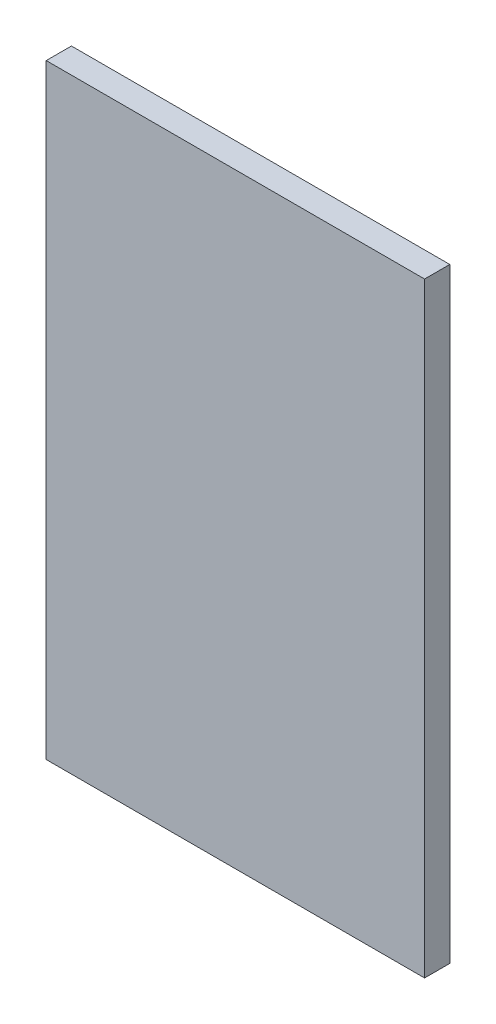
ISO-10303-21;
HEADER;
FILE_DESCRIPTION(('STEP AP214'),'2;1');
FILE_NAME('part.step','',(''),(''),'','','');
FILE_SCHEMA(('AUTOMOTIVE_DESIGN { 1 0 10303 214 1 1 1 1 }'));
ENDSEC;
DATA;
#1=APPLICATION_CONTEXT('core data for automotive mechanical design processes');
#2=APPLICATION_PROTOCOL_DEFINITION('international standard','automotive_design',2000,#1);
#3=PRODUCT_CONTEXT('',#1,'mechanical');
#4=PRODUCT('Part','Part','',(#3));
#5=PRODUCT_RELATED_PRODUCT_CATEGORY('part','',(#4));
#6=PRODUCT_DEFINITION_FORMATION('','',#4);
#7=PRODUCT_DEFINITION_CONTEXT('part definition',#1,'design');
#8=PRODUCT_DEFINITION('design','',#6,#7);
#9=PRODUCT_DEFINITION_SHAPE('','',#8);
#10=(LENGTH_UNIT() NAMED_UNIT(*) SI_UNIT(.MILLI.,.METRE.));
#11=(NAMED_UNIT(*) PLANE_ANGLE_UNIT() SI_UNIT($,.RADIAN.));
#12=(NAMED_UNIT(*) SI_UNIT($,.STERADIAN.) SOLID_ANGLE_UNIT());
#13=UNCERTAINTY_MEASURE_WITH_UNIT(LENGTH_MEASURE(1.E-05),#10,'distance_accuracy_value','');
#14=(GEOMETRIC_REPRESENTATION_CONTEXT(3) GLOBAL_UNCERTAINTY_ASSIGNED_CONTEXT((#13)) GLOBAL_UNIT_ASSIGNED_CONTEXT((#10,
#11,#12)) REPRESENTATION_CONTEXT('',''));
#15=CARTESIAN_POINT('',(0.,0.,0.));
#16=DIRECTION('',(0.,0.,1.));
#17=DIRECTION('',(1.,0.,0.));
#18=AXIS2_PLACEMENT_3D('',#15,#16,#17);
#19=CARTESIAN_POINT('',(-37.5,0.,5.));
#20=DIRECTION('',(1.,0.,0.));
#21=DIRECTION('',(0.,1.,0.));
#22=AXIS2_PLACEMENT_3D('',#19,#20,#21);
#23=PLANE('',#22);
#24=DIRECTION('',(0.,-1.,0.));
#25=VECTOR('',#24,1.);
#26=CARTESIAN_POINT('',(-37.5,0.,0.));
#27=LINE('',#26,#25);
#28=CARTESIAN_POINT('',(-37.5,0.,0.));
#29=VERTEX_POINT('',#28);
#30=CARTESIAN_POINT('',(-37.5,-120.,0.));
#31=VERTEX_POINT('',#30);
#32=EDGE_CURVE('E100',#29,#31,#27,.T.);
#33=ORIENTED_EDGE('',*,*,#32,.T.);
#34=DIRECTION('',(0.,0.,-1.));
#35=VECTOR('',#34,1.);
#36=CARTESIAN_POINT('',(-37.5,-120.,5.));
#37=LINE('',#36,#35);
#38=CARTESIAN_POINT('',(-37.5,-120.,5.));
#39=VERTEX_POINT('',#38);
#40=EDGE_CURVE('E11',#39,#31,#37,.T.);
#41=ORIENTED_EDGE('',*,*,#40,.F.);
#42=DIRECTION('',(0.,-1.,0.));
#43=VECTOR('',#42,1.);
#44=CARTESIAN_POINT('',(-37.5,0.,5.));
#45=LINE('',#44,#43);
#46=CARTESIAN_POINT('',(-37.5,0.,5.));
#47=VERTEX_POINT('',#46);
#48=EDGE_CURVE('E88',#47,#39,#45,.T.);
#49=ORIENTED_EDGE('',*,*,#48,.F.);
#50=DIRECTION('',(0.,0.,-1.));
#51=VECTOR('',#50,1.);
#52=CARTESIAN_POINT('',(-37.5,0.,5.));
#53=LINE('',#52,#51);
#54=EDGE_CURVE('E96',#47,#29,#53,.T.);
#55=ORIENTED_EDGE('',*,*,#54,.T.);
#56=EDGE_LOOP('',(#33,#41,#49,#55));
#57=FACE_BOUND('',#56,.T.);
#58=ADVANCED_FACE('F37',(#57),#23,.F.);
#59=CARTESIAN_POINT('',(-37.5,-120.,5.));
#60=DIRECTION('',(0.,1.,0.));
#61=DIRECTION('',(0.,0.,1.));
#62=AXIS2_PLACEMENT_3D('',#59,#60,#61);
#63=PLANE('',#62);
#64=DIRECTION('',(1.,0.,0.));
#65=VECTOR('',#64,1.);
#66=CARTESIAN_POINT('',(-37.5,-120.,0.));
#67=LINE('',#66,#65);
#68=CARTESIAN_POINT('',(37.5,-120.,0.));
#69=VERTEX_POINT('',#68);
#70=EDGE_CURVE('E92',#31,#69,#67,.T.);
#71=ORIENTED_EDGE('',*,*,#70,.T.);
#72=DIRECTION('',(0.,0.,-1.));
#73=VECTOR('',#72,1.);
#74=CARTESIAN_POINT('',(37.5,-120.,5.));
#75=LINE('',#74,#73);
#76=CARTESIAN_POINT('',(37.5,-120.,5.));
#77=VERTEX_POINT('',#76);
#78=EDGE_CURVE('E45',#77,#69,#75,.T.);
#79=ORIENTED_EDGE('',*,*,#78,.F.);
#80=DIRECTION('',(1.,0.,0.));
#81=VECTOR('',#80,1.);
#82=CARTESIAN_POINT('',(-37.5,-120.,5.));
#83=LINE('',#82,#81);
#84=EDGE_CURVE('E83',#39,#77,#83,.T.);
#85=ORIENTED_EDGE('',*,*,#84,.F.);
#86=ORIENTED_EDGE('',*,*,#40,.T.);
#87=EDGE_LOOP('',(#71,#79,#85,#86));
#88=FACE_BOUND('',#87,.T.);
#89=ADVANCED_FACE('F91',(#88),#63,.F.);
#90=CARTESIAN_POINT('',(37.5,0.,5.));
#91=DIRECTION('',(-1.,0.,0.));
#92=DIRECTION('',(0.,-1.,0.));
#93=AXIS2_PLACEMENT_3D('',#90,#91,#92);
#94=PLANE('',#93);
#95=DIRECTION('',(0.,1.,0.));
#96=VECTOR('',#95,1.);
#97=CARTESIAN_POINT('',(37.5,0.,0.));
#98=LINE('',#97,#96);
#99=CARTESIAN_POINT('',(37.5,0.,0.));
#100=VERTEX_POINT('',#99);
#101=EDGE_CURVE('E70',#69,#100,#98,.T.);
#102=ORIENTED_EDGE('',*,*,#101,.T.);
#103=DIRECTION('',(0.,0.,-1.));
#104=VECTOR('',#103,1.);
#105=CARTESIAN_POINT('',(37.5,0.,5.));
#106=LINE('',#105,#104);
#107=CARTESIAN_POINT('',(37.5,0.,5.));
#108=VERTEX_POINT('',#107);
#109=EDGE_CURVE('E93',#108,#100,#106,.T.);
#110=ORIENTED_EDGE('',*,*,#109,.F.);
#111=DIRECTION('',(0.,1.,0.));
#112=VECTOR('',#111,1.);
#113=CARTESIAN_POINT('',(37.5,0.,5.));
#114=LINE('',#113,#112);
#115=EDGE_CURVE('E86',#77,#108,#114,.T.);
#116=ORIENTED_EDGE('',*,*,#115,.F.);
#117=ORIENTED_EDGE('',*,*,#78,.T.);
#118=EDGE_LOOP('',(#102,#110,#116,#117));
#119=FACE_BOUND('',#118,.T.);
#120=ADVANCED_FACE('F94',(#119),#94,.F.);
#121=CARTESIAN_POINT('',(-37.5,0.,5.));
#122=DIRECTION('',(0.,-1.,0.));
#123=DIRECTION('',(0.,0.,-1.));
#124=AXIS2_PLACEMENT_3D('',#121,#122,#123);
#125=PLANE('',#124);
#126=DIRECTION('',(-1.,0.,0.));
#127=VECTOR('',#126,1.);
#128=CARTESIAN_POINT('',(-37.5,0.,0.));
#129=LINE('',#128,#127);
#130=EDGE_CURVE('E76',#100,#29,#129,.T.);
#131=ORIENTED_EDGE('',*,*,#130,.T.);
#132=ORIENTED_EDGE('',*,*,#54,.F.);
#133=DIRECTION('',(-1.,0.,0.));
#134=VECTOR('',#133,1.);
#135=CARTESIAN_POINT('',(-37.5,0.,5.));
#136=LINE('',#135,#134);
#137=EDGE_CURVE('E53',#108,#47,#136,.T.);
#138=ORIENTED_EDGE('',*,*,#137,.F.);
#139=ORIENTED_EDGE('',*,*,#109,.T.);
#140=EDGE_LOOP('',(#131,#132,#138,#139));
#141=FACE_BOUND('',#140,.T.);
#142=ADVANCED_FACE('F107',(#141),#125,.F.);
#143=CARTESIAN_POINT('',(0.,0.,5.));
#144=DIRECTION('',(0.,0.,1.));
#145=DIRECTION('',(1.,0.,0.));
#146=AXIS2_PLACEMENT_3D('',#143,#144,#145);
#147=PLANE('',#146);
#148=ORIENTED_EDGE('',*,*,#48,.T.);
#149=ORIENTED_EDGE('',*,*,#84,.T.);
#150=ORIENTED_EDGE('',*,*,#115,.T.);
#151=ORIENTED_EDGE('',*,*,#137,.T.);
#152=EDGE_LOOP('',(#148,#149,#150,#151));
#153=FACE_BOUND('',#152,.T.);
#154=ADVANCED_FACE('F84',(#153),#147,.T.);
#155=CARTESIAN_POINT('',(0.,0.,0.));
#156=DIRECTION('',(0.,0.,1.));
#157=DIRECTION('',(1.,0.,0.));
#158=AXIS2_PLACEMENT_3D('',#155,#156,#157);
#159=PLANE('',#158);
#160=ORIENTED_EDGE('',*,*,#32,.F.);
#161=ORIENTED_EDGE('',*,*,#130,.F.);
#162=ORIENTED_EDGE('',*,*,#101,.F.);
#163=ORIENTED_EDGE('',*,*,#70,.F.);
#164=EDGE_LOOP('',(#160,#161,#162,#163));
#165=FACE_BOUND('',#164,.T.);
#166=ADVANCED_FACE('F110',(#165),#159,.F.);
#167=CLOSED_SHELL('',(#58,#89,#120,#142,#154,#166));
#168=MANIFOLD_SOLID_BREP('B2',#167);
#169=ADVANCED_BREP_SHAPE_REPRESENTATION('',(#18,#168),#14);
#170=SHAPE_DEFINITION_REPRESENTATION(#9,#169);
ENDSEC;
END-ISO-10303-21;
